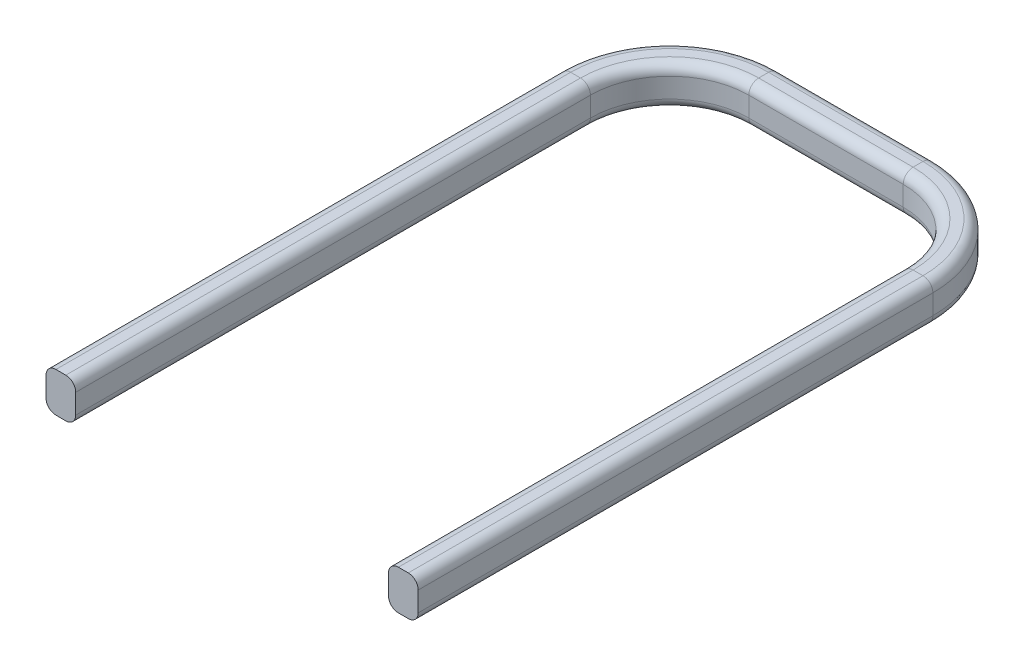
ISO-10303-21;
HEADER;
FILE_DESCRIPTION(('STEP AP214'),'2;1');
FILE_NAME('part.step','',(''),(''),'','','');
FILE_SCHEMA(('AUTOMOTIVE_DESIGN { 1 0 10303 214 1 1 1 1 }'));
ENDSEC;
DATA;
#1=APPLICATION_CONTEXT('core data for automotive mechanical design processes');
#2=APPLICATION_PROTOCOL_DEFINITION('international standard','automotive_design',2000,#1);
#3=PRODUCT_CONTEXT('',#1,'mechanical');
#4=PRODUCT('Part','Part','',(#3));
#5=PRODUCT_RELATED_PRODUCT_CATEGORY('part','',(#4));
#6=PRODUCT_DEFINITION_FORMATION('','',#4);
#7=PRODUCT_DEFINITION_CONTEXT('part definition',#1,'design');
#8=PRODUCT_DEFINITION('design','',#6,#7);
#9=PRODUCT_DEFINITION_SHAPE('','',#8);
#10=(LENGTH_UNIT() NAMED_UNIT(*) SI_UNIT(.MILLI.,.METRE.));
#11=(NAMED_UNIT(*) PLANE_ANGLE_UNIT() SI_UNIT($,.RADIAN.));
#12=(NAMED_UNIT(*) SI_UNIT($,.STERADIAN.) SOLID_ANGLE_UNIT());
#13=UNCERTAINTY_MEASURE_WITH_UNIT(LENGTH_MEASURE(1.E-05),#10,'distance_accuracy_value','');
#14=(GEOMETRIC_REPRESENTATION_CONTEXT(3) GLOBAL_UNCERTAINTY_ASSIGNED_CONTEXT((#13)) GLOBAL_UNIT_ASSIGNED_CONTEXT((#10,
#11,#12)) REPRESENTATION_CONTEXT('',''));
#15=CARTESIAN_POINT('',(0.,0.,0.));
#16=DIRECTION('',(0.,0.,1.));
#17=DIRECTION('',(1.,0.,0.));
#18=AXIS2_PLACEMENT_3D('',#15,#16,#17);
#19=CARTESIAN_POINT('',(0.,0.,0.));
#20=DIRECTION('',(0.,0.,-1.));
#21=DIRECTION('',(-1.,0.,0.));
#22=AXIS2_PLACEMENT_3D('',#19,#20,#21);
#23=PLANE('',#22);
#24=DIRECTION('',(0.,1.,0.));
#25=VECTOR('',#24,1.);
#26=CARTESIAN_POINT('',(3.95,0.,0.));
#27=LINE('',#26,#25);
#28=CARTESIAN_POINT('',(3.95,0.25,0.));
#29=VERTEX_POINT('',#28);
#30=CARTESIAN_POINT('',(3.95,0.75,0.));
#31=VERTEX_POINT('',#30);
#32=EDGE_CURVE('E302',#29,#31,#27,.T.);
#33=ORIENTED_EDGE('',*,*,#32,.F.);
#34=CARTESIAN_POINT('',(4.2,0.25,0.));
#35=DIRECTION('',(0.,0.,-1.));
#36=DIRECTION('',(-1.,0.,0.));
#37=AXIS2_PLACEMENT_3D('',#34,#35,#36);
#38=CIRCLE('',#37,0.25);
#39=CARTESIAN_POINT('',(4.2,0.,0.));
#40=VERTEX_POINT('',#39);
#41=EDGE_CURVE('E209',#29,#40,#38,.F.);
#42=ORIENTED_EDGE('',*,*,#41,.T.);
#43=DIRECTION('',(-1.,0.,0.));
#44=VECTOR('',#43,1.);
#45=CARTESIAN_POINT('',(3.95,0.,0.));
#46=LINE('',#45,#44);
#47=CARTESIAN_POINT('',(4.45,0.,0.));
#48=VERTEX_POINT('',#47);
#49=EDGE_CURVE('E432',#48,#40,#46,.T.);
#50=ORIENTED_EDGE('',*,*,#49,.F.);
#51=CARTESIAN_POINT('',(4.45,0.25,0.));
#52=DIRECTION('',(0.,0.,-1.));
#53=DIRECTION('',(-1.,0.,0.));
#54=AXIS2_PLACEMENT_3D('',#51,#52,#53);
#55=CIRCLE('',#54,0.25);
#56=CARTESIAN_POINT('',(4.7,0.25,0.));
#57=VERTEX_POINT('',#56);
#58=EDGE_CURVE('E230',#48,#57,#55,.F.);
#59=ORIENTED_EDGE('',*,*,#58,.T.);
#60=DIRECTION('',(0.,-1.,0.));
#61=VECTOR('',#60,1.);
#62=CARTESIAN_POINT('',(4.7,0.,0.));
#63=LINE('',#62,#61);
#64=CARTESIAN_POINT('',(4.7,0.75,0.));
#65=VERTEX_POINT('',#64);
#66=EDGE_CURVE('E429',#65,#57,#63,.T.);
#67=ORIENTED_EDGE('',*,*,#66,.F.);
#68=CARTESIAN_POINT('',(4.45,0.75,0.));
#69=DIRECTION('',(0.,0.,-1.));
#70=DIRECTION('',(-1.,0.,0.));
#71=AXIS2_PLACEMENT_3D('',#68,#69,#70);
#72=CIRCLE('',#71,0.25);
#73=CARTESIAN_POINT('',(4.45,1.,0.));
#74=VERTEX_POINT('',#73);
#75=EDGE_CURVE('E459',#65,#74,#72,.F.);
#76=ORIENTED_EDGE('',*,*,#75,.T.);
#77=DIRECTION('',(1.,0.,0.));
#78=VECTOR('',#77,1.);
#79=CARTESIAN_POINT('',(3.95,1.,0.));
#80=LINE('',#79,#78);
#81=CARTESIAN_POINT('',(4.2,1.,0.));
#82=VERTEX_POINT('',#81);
#83=EDGE_CURVE('E433',#82,#74,#80,.T.);
#84=ORIENTED_EDGE('',*,*,#83,.F.);
#85=CARTESIAN_POINT('',(4.2,0.75,0.));
#86=DIRECTION('',(0.,0.,-1.));
#87=DIRECTION('',(-1.,0.,0.));
#88=AXIS2_PLACEMENT_3D('',#85,#86,#87);
#89=CIRCLE('',#88,0.25);
#90=EDGE_CURVE('E462',#82,#31,#89,.F.);
#91=ORIENTED_EDGE('',*,*,#90,.T.);
#92=EDGE_LOOP('',(#33,#42,#50,#59,#67,#76,#84,#91));
#93=FACE_BOUND('',#92,.T.);
#94=ADVANCED_FACE('F33',(#93),#23,.F.);
#95=CARTESIAN_POINT('',(0.,0.,0.));
#96=DIRECTION('',(0.,0.,1.));
#97=DIRECTION('',(1.,0.,0.));
#98=AXIS2_PLACEMENT_3D('',#95,#96,#97);
#99=PLANE('',#98);
#100=DIRECTION('',(0.,-1.,0.));
#101=VECTOR('',#100,1.);
#102=CARTESIAN_POINT('',(-4.7,0.,0.));
#103=LINE('',#102,#101);
#104=CARTESIAN_POINT('',(-4.7,0.75,0.));
#105=VERTEX_POINT('',#104);
#106=CARTESIAN_POINT('',(-4.7,0.25,0.));
#107=VERTEX_POINT('',#106);
#108=EDGE_CURVE('E427',#105,#107,#103,.T.);
#109=ORIENTED_EDGE('',*,*,#108,.T.);
#110=CARTESIAN_POINT('',(-4.45,0.25,0.));
#111=DIRECTION('',(0.,0.,1.));
#112=DIRECTION('',(1.,0.,0.));
#113=AXIS2_PLACEMENT_3D('',#110,#111,#112);
#114=CIRCLE('',#113,0.25);
#115=CARTESIAN_POINT('',(-4.45,0.,0.));
#116=VERTEX_POINT('',#115);
#117=EDGE_CURVE('E349',#107,#116,#114,.T.);
#118=ORIENTED_EDGE('',*,*,#117,.T.);
#119=DIRECTION('',(1.,0.,0.));
#120=VECTOR('',#119,1.);
#121=CARTESIAN_POINT('',(-3.95,0.,0.));
#122=LINE('',#121,#120);
#123=CARTESIAN_POINT('',(-4.2,0.,0.));
#124=VERTEX_POINT('',#123);
#125=EDGE_CURVE('E231',#116,#124,#122,.T.);
#126=ORIENTED_EDGE('',*,*,#125,.T.);
#127=CARTESIAN_POINT('',(-4.2,0.25,0.));
#128=DIRECTION('',(0.,0.,1.));
#129=DIRECTION('',(1.,0.,0.));
#130=AXIS2_PLACEMENT_3D('',#127,#128,#129);
#131=CIRCLE('',#130,0.25);
#132=CARTESIAN_POINT('',(-3.95,0.25,0.));
#133=VERTEX_POINT('',#132);
#134=EDGE_CURVE('E345',#124,#133,#131,.T.);
#135=ORIENTED_EDGE('',*,*,#134,.T.);
#136=DIRECTION('',(0.,1.,0.));
#137=VECTOR('',#136,1.);
#138=CARTESIAN_POINT('',(-3.95,0.,0.));
#139=LINE('',#138,#137);
#140=CARTESIAN_POINT('',(-3.95,0.75,0.));
#141=VERTEX_POINT('',#140);
#142=EDGE_CURVE('E428',#133,#141,#139,.T.);
#143=ORIENTED_EDGE('',*,*,#142,.T.);
#144=CARTESIAN_POINT('',(-4.2,0.75,0.));
#145=DIRECTION('',(0.,0.,1.));
#146=DIRECTION('',(1.,0.,0.));
#147=AXIS2_PLACEMENT_3D('',#144,#145,#146);
#148=CIRCLE('',#147,0.25);
#149=CARTESIAN_POINT('',(-4.2,1.,0.));
#150=VERTEX_POINT('',#149);
#151=EDGE_CURVE('E281',#141,#150,#148,.T.);
#152=ORIENTED_EDGE('',*,*,#151,.T.);
#153=DIRECTION('',(-1.,0.,0.));
#154=VECTOR('',#153,1.);
#155=CARTESIAN_POINT('',(-3.95,1.,0.));
#156=LINE('',#155,#154);
#157=CARTESIAN_POINT('',(-4.45,1.,0.));
#158=VERTEX_POINT('',#157);
#159=EDGE_CURVE('E425',#150,#158,#156,.T.);
#160=ORIENTED_EDGE('',*,*,#159,.T.);
#161=CARTESIAN_POINT('',(-4.45,0.75,0.));
#162=DIRECTION('',(0.,0.,1.));
#163=DIRECTION('',(1.,0.,0.));
#164=AXIS2_PLACEMENT_3D('',#161,#162,#163);
#165=CIRCLE('',#164,0.25);
#166=EDGE_CURVE('E347',#158,#105,#165,.T.);
#167=ORIENTED_EDGE('',*,*,#166,.T.);
#168=EDGE_LOOP('',(#109,#118,#126,#135,#143,#152,#160,#167));
#169=FACE_BOUND('',#168,.T.);
#170=ADVANCED_FACE('F559',(#169),#99,.T.);
#171=CARTESIAN_POINT('',(3.95,0.,0.));
#172=DIRECTION('',(-1.,0.,0.));
#173=DIRECTION('',(0.,0.,1.));
#174=AXIS2_PLACEMENT_3D('',#171,#172,#173);
#175=PLANE('',#174);
#176=DIRECTION('',(0.,1.,0.));
#177=VECTOR('',#176,1.);
#178=CARTESIAN_POINT('',(3.95,0.,-13.));
#179=LINE('',#178,#177);
#180=CARTESIAN_POINT('',(3.95,0.25,-13.));
#181=VERTEX_POINT('',#180);
#182=CARTESIAN_POINT('',(3.95,0.75,-13.));
#183=VERTEX_POINT('',#182);
#184=EDGE_CURVE('E443',#181,#183,#179,.T.);
#185=ORIENTED_EDGE('',*,*,#184,.F.);
#186=DIRECTION('',(0.,0.,-1.));
#187=VECTOR('',#186,1.);
#188=CARTESIAN_POINT('',(3.95,0.25,0.));
#189=LINE('',#188,#187);
#190=EDGE_CURVE('E457',#181,#29,#189,.F.);
#191=ORIENTED_EDGE('',*,*,#190,.T.);
#192=ORIENTED_EDGE('',*,*,#32,.T.);
#193=DIRECTION('',(0.,0.,-1.));
#194=VECTOR('',#193,1.);
#195=CARTESIAN_POINT('',(3.95,0.75,0.));
#196=LINE('',#195,#194);
#197=EDGE_CURVE('E454',#31,#183,#196,.T.);
#198=ORIENTED_EDGE('',*,*,#197,.T.);
#199=EDGE_LOOP('',(#185,#191,#192,#198));
#200=FACE_BOUND('',#199,.T.);
#201=ADVANCED_FACE('F519',(#200),#175,.T.);
#202=CARTESIAN_POINT('',(3.95,1.,0.));
#203=DIRECTION('',(0.,1.,0.));
#204=DIRECTION('',(-1.,0.,0.));
#205=AXIS2_PLACEMENT_3D('',#202,#203,#204);
#206=PLANE('',#205);
#207=DIRECTION('',(1.,0.,0.));
#208=VECTOR('',#207,1.);
#209=CARTESIAN_POINT('',(3.95,1.,-13.));
#210=LINE('',#209,#208);
#211=CARTESIAN_POINT('',(4.2,1.,-13.));
#212=VERTEX_POINT('',#211);
#213=CARTESIAN_POINT('',(4.45,1.,-13.));
#214=VERTEX_POINT('',#213);
#215=EDGE_CURVE('E382',#212,#214,#210,.T.);
#216=ORIENTED_EDGE('',*,*,#215,.F.);
#217=DIRECTION('',(0.,0.,-1.));
#218=VECTOR('',#217,1.);
#219=CARTESIAN_POINT('',(4.2,1.,0.));
#220=LINE('',#219,#218);
#221=EDGE_CURVE('E287',#212,#82,#220,.F.);
#222=ORIENTED_EDGE('',*,*,#221,.T.);
#223=ORIENTED_EDGE('',*,*,#83,.T.);
#224=DIRECTION('',(0.,0.,-1.));
#225=VECTOR('',#224,1.);
#226=CARTESIAN_POINT('',(4.45,1.,0.));
#227=LINE('',#226,#225);
#228=EDGE_CURVE('E50',#74,#214,#227,.T.);
#229=ORIENTED_EDGE('',*,*,#228,.T.);
#230=EDGE_LOOP('',(#216,#222,#223,#229));
#231=FACE_BOUND('',#230,.T.);
#232=ADVANCED_FACE('F489',(#231),#206,.T.);
#233=CARTESIAN_POINT('',(4.7,0.,0.));
#234=DIRECTION('',(1.,0.,0.));
#235=DIRECTION('',(0.,0.,-1.));
#236=AXIS2_PLACEMENT_3D('',#233,#234,#235);
#237=PLANE('',#236);
#238=ORIENTED_EDGE('',*,*,#66,.T.);
#239=DIRECTION('',(0.,0.,-1.));
#240=VECTOR('',#239,1.);
#241=CARTESIAN_POINT('',(4.7,0.25,0.));
#242=LINE('',#241,#240);
#243=CARTESIAN_POINT('',(4.7,0.25,-13.));
#244=VERTEX_POINT('',#243);
#245=EDGE_CURVE('E11',#57,#244,#242,.T.);
#246=ORIENTED_EDGE('',*,*,#245,.T.);
#247=DIRECTION('',(0.,-1.,0.));
#248=VECTOR('',#247,1.);
#249=CARTESIAN_POINT('',(4.7,0.,-13.));
#250=LINE('',#249,#248);
#251=CARTESIAN_POINT('',(4.7,0.75,-13.));
#252=VERTEX_POINT('',#251);
#253=EDGE_CURVE('E221',#252,#244,#250,.T.);
#254=ORIENTED_EDGE('',*,*,#253,.F.);
#255=DIRECTION('',(0.,0.,-1.));
#256=VECTOR('',#255,1.);
#257=CARTESIAN_POINT('',(4.7,0.75,0.));
#258=LINE('',#257,#256);
#259=EDGE_CURVE('E42',#252,#65,#258,.F.);
#260=ORIENTED_EDGE('',*,*,#259,.T.);
#261=EDGE_LOOP('',(#238,#246,#254,#260));
#262=FACE_BOUND('',#261,.T.);
#263=ADVANCED_FACE('F524',(#262),#237,.T.);
#264=CARTESIAN_POINT('',(3.95,0.,0.));
#265=DIRECTION('',(0.,-1.,0.));
#266=DIRECTION('',(1.,0.,0.));
#267=AXIS2_PLACEMENT_3D('',#264,#265,#266);
#268=PLANE('',#267);
#269=ORIENTED_EDGE('',*,*,#49,.T.);
#270=DIRECTION('',(0.,0.,-1.));
#271=VECTOR('',#270,1.);
#272=CARTESIAN_POINT('',(4.2,0.,0.));
#273=LINE('',#272,#271);
#274=CARTESIAN_POINT('',(4.2,0.,-13.));
#275=VERTEX_POINT('',#274);
#276=EDGE_CURVE('E219',#40,#275,#273,.T.);
#277=ORIENTED_EDGE('',*,*,#276,.T.);
#278=DIRECTION('',(-1.,0.,0.));
#279=VECTOR('',#278,1.);
#280=CARTESIAN_POINT('',(3.95,0.,-13.));
#281=LINE('',#280,#279);
#282=CARTESIAN_POINT('',(4.45,0.,-13.));
#283=VERTEX_POINT('',#282);
#284=EDGE_CURVE('E201',#283,#275,#281,.T.);
#285=ORIENTED_EDGE('',*,*,#284,.F.);
#286=DIRECTION('',(0.,0.,-1.));
#287=VECTOR('',#286,1.);
#288=CARTESIAN_POINT('',(4.45,0.,0.));
#289=LINE('',#288,#287);
#290=EDGE_CURVE('E216',#283,#48,#289,.F.);
#291=ORIENTED_EDGE('',*,*,#290,.T.);
#292=EDGE_LOOP('',(#269,#277,#285,#291));
#293=FACE_BOUND('',#292,.T.);
#294=ADVANCED_FACE('F215',(#293),#268,.T.);
#295=CARTESIAN_POINT('',(1.95,0.,-13.));
#296=DIRECTION('',(0.,1.,0.));
#297=DIRECTION('',(0.,0.,1.));
#298=AXIS2_PLACEMENT_3D('',#295,#296,#297);
#299=CYLINDRICAL_SURFACE('',#298,2.);
#300=DIRECTION('',(0.,1.,0.));
#301=VECTOR('',#300,1.);
#302=CARTESIAN_POINT('',(1.94999999999999,0.,-15.));
#303=LINE('',#302,#301);
#304=CARTESIAN_POINT('',(1.94999999999999,0.25,-15.));
#305=VERTEX_POINT('',#304);
#306=CARTESIAN_POINT('',(1.94999999999999,0.75,-15.));
#307=VERTEX_POINT('',#306);
#308=EDGE_CURVE('E220',#305,#307,#303,.T.);
#309=ORIENTED_EDGE('',*,*,#308,.F.);
#310=CARTESIAN_POINT('',(1.95,0.25,-13.));
#311=DIRECTION('',(0.,-1.,0.));
#312=DIRECTION('',(0.,0.,-1.));
#313=AXIS2_PLACEMENT_3D('',#310,#311,#312);
#314=CIRCLE('',#313,2.);
#315=EDGE_CURVE('E322',#305,#181,#314,.T.);
#316=ORIENTED_EDGE('',*,*,#315,.T.);
#317=ORIENTED_EDGE('',*,*,#184,.T.);
#318=CARTESIAN_POINT('',(1.95,0.75,-13.));
#319=DIRECTION('',(0.,1.,0.));
#320=DIRECTION('',(0.,0.,1.));
#321=AXIS2_PLACEMENT_3D('',#318,#319,#320);
#322=CIRCLE('',#321,2.);
#323=EDGE_CURVE('E326',#183,#307,#322,.T.);
#324=ORIENTED_EDGE('',*,*,#323,.T.);
#325=EDGE_LOOP('',(#309,#316,#317,#324));
#326=FACE_BOUND('',#325,.T.);
#327=ADVANCED_FACE('F470',(#326),#299,.F.);
#328=CARTESIAN_POINT('',(3.95,1.,-13.));
#329=DIRECTION('',(0.,1.,0.));
#330=DIRECTION('',(0.,0.,1.));
#331=AXIS2_PLACEMENT_3D('',#328,#329,#330);
#332=PLANE('',#331);
#333=ORIENTED_EDGE('',*,*,#215,.T.);
#334=CARTESIAN_POINT('',(1.95,1.,-13.));
#335=DIRECTION('',(0.,1.,0.));
#336=DIRECTION('',(0.,0.,1.));
#337=AXIS2_PLACEMENT_3D('',#334,#335,#336);
#338=CIRCLE('',#337,2.5);
#339=CARTESIAN_POINT('',(1.94999999999998,1.,-15.5));
#340=VERTEX_POINT('',#339);
#341=EDGE_CURVE('E376',#214,#340,#338,.T.);
#342=ORIENTED_EDGE('',*,*,#341,.T.);
#343=DIRECTION('',(0.,0.,-1.));
#344=VECTOR('',#343,1.);
#345=CARTESIAN_POINT('',(1.94999999999999,1.,-15.));
#346=LINE('',#345,#344);
#347=CARTESIAN_POINT('',(1.94999999999998,1.,-15.25));
#348=VERTEX_POINT('',#347);
#349=EDGE_CURVE('E380',#348,#340,#346,.T.);
#350=ORIENTED_EDGE('',*,*,#349,.F.);
#351=CARTESIAN_POINT('',(1.95,1.,-13.));
#352=DIRECTION('',(0.,1.,0.));
#353=DIRECTION('',(0.,0.,1.));
#354=AXIS2_PLACEMENT_3D('',#351,#352,#353);
#355=CIRCLE('',#354,2.25);
#356=EDGE_CURVE('E57',#348,#212,#355,.F.);
#357=ORIENTED_EDGE('',*,*,#356,.T.);
#358=EDGE_LOOP('',(#333,#342,#350,#357));
#359=FACE_BOUND('',#358,.T.);
#360=ADVANCED_FACE('F379',(#359),#332,.T.);
#361=CARTESIAN_POINT('',(1.95,0.,-13.));
#362=DIRECTION('',(0.,1.,0.));
#363=DIRECTION('',(0.,0.,1.));
#364=AXIS2_PLACEMENT_3D('',#361,#362,#363);
#365=CYLINDRICAL_SURFACE('',#364,2.75);
#366=ORIENTED_EDGE('',*,*,#253,.T.);
#367=CARTESIAN_POINT('',(1.95,0.25,-13.));
#368=DIRECTION('',(0.,-1.,0.));
#369=DIRECTION('',(0.,0.,-1.));
#370=AXIS2_PLACEMENT_3D('',#367,#368,#369);
#371=CIRCLE('',#370,2.75);
#372=CARTESIAN_POINT('',(1.94999999999998,0.25,-15.75));
#373=VERTEX_POINT('',#372);
#374=EDGE_CURVE('E234',#244,#373,#371,.F.);
#375=ORIENTED_EDGE('',*,*,#374,.T.);
#376=DIRECTION('',(0.,-1.,0.));
#377=VECTOR('',#376,1.);
#378=CARTESIAN_POINT('',(1.94999999999998,0.,-15.75));
#379=LINE('',#378,#377);
#380=CARTESIAN_POINT('',(1.94999999999998,0.75,-15.75));
#381=VERTEX_POINT('',#380);
#382=EDGE_CURVE('E391',#381,#373,#379,.T.);
#383=ORIENTED_EDGE('',*,*,#382,.F.);
#384=CARTESIAN_POINT('',(1.95,0.75,-13.));
#385=DIRECTION('',(0.,1.,0.));
#386=DIRECTION('',(0.,0.,1.));
#387=AXIS2_PLACEMENT_3D('',#384,#385,#386);
#388=CIRCLE('',#387,2.75);
#389=EDGE_CURVE('E361',#381,#252,#388,.F.);
#390=ORIENTED_EDGE('',*,*,#389,.T.);
#391=EDGE_LOOP('',(#366,#375,#383,#390));
#392=FACE_BOUND('',#391,.T.);
#393=ADVANCED_FACE('F793',(#392),#365,.T.);
#394=CARTESIAN_POINT('',(3.95,0.,-13.));
#395=DIRECTION('',(0.,-1.,0.));
#396=DIRECTION('',(0.,0.,-1.));
#397=AXIS2_PLACEMENT_3D('',#394,#395,#396);
#398=PLANE('',#397);
#399=ORIENTED_EDGE('',*,*,#284,.T.);
#400=CARTESIAN_POINT('',(1.95,0.,-13.));
#401=DIRECTION('',(0.,-1.,0.));
#402=DIRECTION('',(0.,0.,-1.));
#403=AXIS2_PLACEMENT_3D('',#400,#401,#402);
#404=CIRCLE('',#403,2.25);
#405=CARTESIAN_POINT('',(1.94999999999998,0.,-15.25));
#406=VERTEX_POINT('',#405);
#407=EDGE_CURVE('E208',#275,#406,#404,.F.);
#408=ORIENTED_EDGE('',*,*,#407,.T.);
#409=DIRECTION('',(0.,0.,1.));
#410=VECTOR('',#409,1.);
#411=CARTESIAN_POINT('',(1.94999999999999,0.,-15.));
#412=LINE('',#411,#410);
#413=CARTESIAN_POINT('',(1.94999999999998,0.,-15.5));
#414=VERTEX_POINT('',#413);
#415=EDGE_CURVE('E203',#414,#406,#412,.T.);
#416=ORIENTED_EDGE('',*,*,#415,.F.);
#417=CARTESIAN_POINT('',(1.95,0.,-13.));
#418=DIRECTION('',(0.,-1.,0.));
#419=DIRECTION('',(0.,0.,-1.));
#420=AXIS2_PLACEMENT_3D('',#417,#418,#419);
#421=CIRCLE('',#420,2.5);
#422=EDGE_CURVE('E198',#414,#283,#421,.T.);
#423=ORIENTED_EDGE('',*,*,#422,.T.);
#424=EDGE_LOOP('',(#399,#408,#416,#423));
#425=FACE_BOUND('',#424,.T.);
#426=ADVANCED_FACE('F200',(#425),#398,.T.);
#427=CARTESIAN_POINT('',(1.94999999999999,0.,-15.));
#428=DIRECTION('',(0.,0.,1.));
#429=DIRECTION('',(1.,0.,0.));
#430=AXIS2_PLACEMENT_3D('',#427,#428,#429);
#431=PLANE('',#430);
#432=DIRECTION('',(0.,1.,0.));
#433=VECTOR('',#432,1.);
#434=CARTESIAN_POINT('',(-1.95,0.,-15.));
#435=LINE('',#434,#433);
#436=CARTESIAN_POINT('',(-1.95,0.25,-15.));
#437=VERTEX_POINT('',#436);
#438=CARTESIAN_POINT('',(-1.95,0.75,-15.));
#439=VERTEX_POINT('',#438);
#440=EDGE_CURVE('E446',#437,#439,#435,.T.);
#441=ORIENTED_EDGE('',*,*,#440,.F.);
#442=DIRECTION('',(-1.,0.,0.));
#443=VECTOR('',#442,1.);
#444=CARTESIAN_POINT('',(1.94999999999999,0.25,-15.));
#445=LINE('',#444,#443);
#446=EDGE_CURVE('E331',#437,#305,#445,.F.);
#447=ORIENTED_EDGE('',*,*,#446,.T.);
#448=ORIENTED_EDGE('',*,*,#308,.T.);
#449=DIRECTION('',(-1.,0.,0.));
#450=VECTOR('',#449,1.);
#451=CARTESIAN_POINT('',(1.94999999999999,0.75,-15.));
#452=LINE('',#451,#450);
#453=EDGE_CURVE('E324',#307,#439,#452,.T.);
#454=ORIENTED_EDGE('',*,*,#453,.T.);
#455=EDGE_LOOP('',(#441,#447,#448,#454));
#456=FACE_BOUND('',#455,.T.);
#457=ADVANCED_FACE('F477',(#456),#431,.T.);
#458=CARTESIAN_POINT('',(1.94999999999999,1.,-15.));
#459=DIRECTION('',(0.,1.,0.));
#460=DIRECTION('',(0.,0.,1.));
#461=AXIS2_PLACEMENT_3D('',#458,#459,#460);
#462=PLANE('',#461);
#463=ORIENTED_EDGE('',*,*,#349,.T.);
#464=DIRECTION('',(-1.,0.,0.));
#465=VECTOR('',#464,1.);
#466=CARTESIAN_POINT('',(1.94999999999999,1.,-15.5));
#467=LINE('',#466,#465);
#468=CARTESIAN_POINT('',(-1.95,1.,-15.5));
#469=VERTEX_POINT('',#468);
#470=EDGE_CURVE('E373',#340,#469,#467,.T.);
#471=ORIENTED_EDGE('',*,*,#470,.T.);
#472=DIRECTION('',(0.,0.,-1.));
#473=VECTOR('',#472,1.);
#474=CARTESIAN_POINT('',(-1.95,1.,-15.));
#475=LINE('',#474,#473);
#476=CARTESIAN_POINT('',(-1.95,1.,-15.25));
#477=VERTEX_POINT('',#476);
#478=EDGE_CURVE('E410',#477,#469,#475,.T.);
#479=ORIENTED_EDGE('',*,*,#478,.F.);
#480=DIRECTION('',(-1.,0.,0.));
#481=VECTOR('',#480,1.);
#482=CARTESIAN_POINT('',(1.94999999999999,1.,-15.25));
#483=LINE('',#482,#481);
#484=EDGE_CURVE('E371',#477,#348,#483,.F.);
#485=ORIENTED_EDGE('',*,*,#484,.T.);
#486=EDGE_LOOP('',(#463,#471,#479,#485));
#487=FACE_BOUND('',#486,.T.);
#488=ADVANCED_FACE('F387',(#487),#462,.T.);
#489=CARTESIAN_POINT('',(1.94999999999999,0.,-15.75));
#490=DIRECTION('',(0.,0.,-1.));
#491=DIRECTION('',(-1.,0.,0.));
#492=AXIS2_PLACEMENT_3D('',#489,#490,#491);
#493=PLANE('',#492);
#494=ORIENTED_EDGE('',*,*,#382,.T.);
#495=DIRECTION('',(-1.,0.,0.));
#496=VECTOR('',#495,1.);
#497=CARTESIAN_POINT('',(1.94999999999999,0.25,-15.75));
#498=LINE('',#497,#496);
#499=CARTESIAN_POINT('',(-1.95,0.25,-15.75));
#500=VERTEX_POINT('',#499);
#501=EDGE_CURVE('E317',#373,#500,#498,.T.);
#502=ORIENTED_EDGE('',*,*,#501,.T.);
#503=DIRECTION('',(0.,-1.,0.));
#504=VECTOR('',#503,1.);
#505=CARTESIAN_POINT('',(-1.95,0.,-15.75));
#506=LINE('',#505,#504);
#507=CARTESIAN_POINT('',(-1.95,0.75,-15.75));
#508=VERTEX_POINT('',#507);
#509=EDGE_CURVE('E438',#508,#500,#506,.T.);
#510=ORIENTED_EDGE('',*,*,#509,.F.);
#511=DIRECTION('',(-1.,0.,0.));
#512=VECTOR('',#511,1.);
#513=CARTESIAN_POINT('',(1.94999999999999,0.75,-15.75));
#514=LINE('',#513,#512);
#515=EDGE_CURVE('E358',#508,#381,#514,.F.);
#516=ORIENTED_EDGE('',*,*,#515,.T.);
#517=EDGE_LOOP('',(#494,#502,#510,#516));
#518=FACE_BOUND('',#517,.T.);
#519=ADVANCED_FACE('F764',(#518),#493,.T.);
#520=CARTESIAN_POINT('',(1.94999999999999,0.,-15.));
#521=DIRECTION('',(0.,-1.,0.));
#522=DIRECTION('',(0.,0.,-1.));
#523=AXIS2_PLACEMENT_3D('',#520,#521,#522);
#524=PLANE('',#523);
#525=ORIENTED_EDGE('',*,*,#415,.T.);
#526=DIRECTION('',(-1.,0.,0.));
#527=VECTOR('',#526,1.);
#528=CARTESIAN_POINT('',(1.94999999999999,0.,-15.25));
#529=LINE('',#528,#527);
#530=CARTESIAN_POINT('',(-1.95,0.,-15.25));
#531=VERTEX_POINT('',#530);
#532=EDGE_CURVE('E321',#406,#531,#529,.T.);
#533=ORIENTED_EDGE('',*,*,#532,.T.);
#534=DIRECTION('',(0.,0.,1.));
#535=VECTOR('',#534,1.);
#536=CARTESIAN_POINT('',(-1.95,0.,-15.));
#537=LINE('',#536,#535);
#538=CARTESIAN_POINT('',(-1.95,0.,-15.5));
#539=VERTEX_POINT('',#538);
#540=EDGE_CURVE('E421',#539,#531,#537,.T.);
#541=ORIENTED_EDGE('',*,*,#540,.F.);
#542=DIRECTION('',(-1.,0.,0.));
#543=VECTOR('',#542,1.);
#544=CARTESIAN_POINT('',(1.94999999999999,0.,-15.5));
#545=LINE('',#544,#543);
#546=EDGE_CURVE('E318',#539,#414,#545,.F.);
#547=ORIENTED_EDGE('',*,*,#546,.T.);
#548=EDGE_LOOP('',(#525,#533,#541,#547));
#549=FACE_BOUND('',#548,.T.);
#550=ADVANCED_FACE('F756',(#549),#524,.T.);
#551=CARTESIAN_POINT('',(-1.95,0.,-13.));
#552=DIRECTION('',(0.,1.,0.));
#553=DIRECTION('',(0.,0.,1.));
#554=AXIS2_PLACEMENT_3D('',#551,#552,#553);
#555=CYLINDRICAL_SURFACE('',#554,2.);
#556=DIRECTION('',(0.,1.,0.));
#557=VECTOR('',#556,1.);
#558=CARTESIAN_POINT('',(-3.95,0.,-13.));
#559=LINE('',#558,#557);
#560=CARTESIAN_POINT('',(-3.95,0.25,-13.));
#561=VERTEX_POINT('',#560);
#562=CARTESIAN_POINT('',(-3.95,0.75,-13.));
#563=VERTEX_POINT('',#562);
#564=EDGE_CURVE('E416',#561,#563,#559,.T.);
#565=ORIENTED_EDGE('',*,*,#564,.F.);
#566=CARTESIAN_POINT('',(-1.95,0.25,-13.));
#567=DIRECTION('',(0.,-1.,0.));
#568=DIRECTION('',(0.,0.,-1.));
#569=AXIS2_PLACEMENT_3D('',#566,#567,#568);
#570=CIRCLE('',#569,2.);
#571=EDGE_CURVE('E337',#561,#437,#570,.T.);
#572=ORIENTED_EDGE('',*,*,#571,.T.);
#573=ORIENTED_EDGE('',*,*,#440,.T.);
#574=CARTESIAN_POINT('',(-1.95,0.75,-13.));
#575=DIRECTION('',(0.,1.,0.));
#576=DIRECTION('',(0.,0.,1.));
#577=AXIS2_PLACEMENT_3D('',#574,#575,#576);
#578=CIRCLE('',#577,2.);
#579=EDGE_CURVE('E273',#439,#563,#578,.T.);
#580=ORIENTED_EDGE('',*,*,#579,.T.);
#581=EDGE_LOOP('',(#565,#572,#573,#580));
#582=FACE_BOUND('',#581,.T.);
#583=ADVANCED_FACE('F503',(#582),#555,.F.);
#584=CARTESIAN_POINT('',(-1.95,1.,-15.));
#585=DIRECTION('',(0.,1.,0.));
#586=DIRECTION('',(0.,0.,1.));
#587=AXIS2_PLACEMENT_3D('',#584,#585,#586);
#588=PLANE('',#587);
#589=ORIENTED_EDGE('',*,*,#478,.T.);
#590=CARTESIAN_POINT('',(-1.95,1.,-13.));
#591=DIRECTION('',(0.,1.,0.));
#592=DIRECTION('',(0.,0.,1.));
#593=AXIS2_PLACEMENT_3D('',#590,#591,#592);
#594=CIRCLE('',#593,2.5);
#595=CARTESIAN_POINT('',(-4.45,1.,-13.));
#596=VERTEX_POINT('',#595);
#597=EDGE_CURVE('E369',#469,#596,#594,.T.);
#598=ORIENTED_EDGE('',*,*,#597,.T.);
#599=DIRECTION('',(-1.,0.,0.));
#600=VECTOR('',#599,1.);
#601=CARTESIAN_POINT('',(-3.95,1.,-13.));
#602=LINE('',#601,#600);
#603=CARTESIAN_POINT('',(-4.2,1.,-13.));
#604=VERTEX_POINT('',#603);
#605=EDGE_CURVE('E409',#604,#596,#602,.T.);
#606=ORIENTED_EDGE('',*,*,#605,.F.);
#607=CARTESIAN_POINT('',(-1.95,1.,-13.));
#608=DIRECTION('',(0.,1.,0.));
#609=DIRECTION('',(0.,0.,1.));
#610=AXIS2_PLACEMENT_3D('',#607,#608,#609);
#611=CIRCLE('',#610,2.25);
#612=EDGE_CURVE('E274',#604,#477,#611,.F.);
#613=ORIENTED_EDGE('',*,*,#612,.T.);
#614=EDGE_LOOP('',(#589,#598,#606,#613));
#615=FACE_BOUND('',#614,.T.);
#616=ADVANCED_FACE('F408',(#615),#588,.T.);
#617=CARTESIAN_POINT('',(-1.95,0.,-13.));
#618=DIRECTION('',(0.,1.,0.));
#619=DIRECTION('',(0.,0.,1.));
#620=AXIS2_PLACEMENT_3D('',#617,#618,#619);
#621=CYLINDRICAL_SURFACE('',#620,2.75);
#622=ORIENTED_EDGE('',*,*,#509,.T.);
#623=CARTESIAN_POINT('',(-1.95,0.25,-13.));
#624=DIRECTION('',(0.,-1.,0.));
#625=DIRECTION('',(0.,0.,-1.));
#626=AXIS2_PLACEMENT_3D('',#623,#624,#625);
#627=CIRCLE('',#626,2.75);
#628=CARTESIAN_POINT('',(-4.7,0.25,-13.));
#629=VERTEX_POINT('',#628);
#630=EDGE_CURVE('E312',#500,#629,#627,.F.);
#631=ORIENTED_EDGE('',*,*,#630,.T.);
#632=DIRECTION('',(0.,-1.,0.));
#633=VECTOR('',#632,1.);
#634=CARTESIAN_POINT('',(-4.7,0.,-13.));
#635=LINE('',#634,#633);
#636=CARTESIAN_POINT('',(-4.7,0.75,-13.));
#637=VERTEX_POINT('',#636);
#638=EDGE_CURVE('E415',#637,#629,#635,.T.);
#639=ORIENTED_EDGE('',*,*,#638,.F.);
#640=CARTESIAN_POINT('',(-1.95,0.75,-13.));
#641=DIRECTION('',(0.,1.,0.));
#642=DIRECTION('',(0.,0.,1.));
#643=AXIS2_PLACEMENT_3D('',#640,#641,#642);
#644=CIRCLE('',#643,2.75);
#645=EDGE_CURVE('E355',#637,#508,#644,.F.);
#646=ORIENTED_EDGE('',*,*,#645,.T.);
#647=EDGE_LOOP('',(#622,#631,#639,#646));
#648=FACE_BOUND('',#647,.T.);
#649=ADVANCED_FACE('F733',(#648),#621,.T.);
#650=CARTESIAN_POINT('',(-1.95,0.,-15.));
#651=DIRECTION('',(0.,-1.,0.));
#652=DIRECTION('',(0.,0.,-1.));
#653=AXIS2_PLACEMENT_3D('',#650,#651,#652);
#654=PLANE('',#653);
#655=ORIENTED_EDGE('',*,*,#540,.T.);
#656=CARTESIAN_POINT('',(-1.95,0.,-13.));
#657=DIRECTION('',(0.,-1.,0.));
#658=DIRECTION('',(0.,0.,-1.));
#659=AXIS2_PLACEMENT_3D('',#656,#657,#658);
#660=CIRCLE('',#659,2.25);
#661=CARTESIAN_POINT('',(-4.2,0.,-13.));
#662=VERTEX_POINT('',#661);
#663=EDGE_CURVE('E334',#531,#662,#660,.F.);
#664=ORIENTED_EDGE('',*,*,#663,.T.);
#665=DIRECTION('',(1.,0.,0.));
#666=VECTOR('',#665,1.);
#667=CARTESIAN_POINT('',(-3.95,0.,-13.));
#668=LINE('',#667,#666);
#669=CARTESIAN_POINT('',(-4.45,0.,-13.));
#670=VERTEX_POINT('',#669);
#671=EDGE_CURVE('E419',#670,#662,#668,.T.);
#672=ORIENTED_EDGE('',*,*,#671,.F.);
#673=CARTESIAN_POINT('',(-1.95,0.,-13.));
#674=DIRECTION('',(0.,-1.,0.));
#675=DIRECTION('',(0.,0.,-1.));
#676=AXIS2_PLACEMENT_3D('',#673,#674,#675);
#677=CIRCLE('',#676,2.5);
#678=EDGE_CURVE('E311',#670,#539,#677,.T.);
#679=ORIENTED_EDGE('',*,*,#678,.T.);
#680=EDGE_LOOP('',(#655,#664,#672,#679));
#681=FACE_BOUND('',#680,.T.);
#682=ADVANCED_FACE('F557',(#681),#654,.T.);
#683=CARTESIAN_POINT('',(-3.95,0.,-13.));
#684=DIRECTION('',(1.,0.,0.));
#685=DIRECTION('',(0.,0.,-1.));
#686=AXIS2_PLACEMENT_3D('',#683,#684,#685);
#687=PLANE('',#686);
#688=ORIENTED_EDGE('',*,*,#142,.F.);
#689=DIRECTION('',(0.,0.,1.));
#690=VECTOR('',#689,1.);
#691=CARTESIAN_POINT('',(-3.95,0.25,-13.));
#692=LINE('',#691,#690);
#693=EDGE_CURVE('E286',#133,#561,#692,.F.);
#694=ORIENTED_EDGE('',*,*,#693,.T.);
#695=ORIENTED_EDGE('',*,*,#564,.T.);
#696=DIRECTION('',(0.,0.,1.));
#697=VECTOR('',#696,1.);
#698=CARTESIAN_POINT('',(-3.95,0.75,-13.));
#699=LINE('',#698,#697);
#700=EDGE_CURVE('E280',#563,#141,#699,.T.);
#701=ORIENTED_EDGE('',*,*,#700,.T.);
#702=EDGE_LOOP('',(#688,#694,#695,#701));
#703=FACE_BOUND('',#702,.T.);
#704=ADVANCED_FACE('F718',(#703),#687,.T.);
#705=CARTESIAN_POINT('',(-3.95,1.,-13.));
#706=DIRECTION('',(0.,1.,0.));
#707=DIRECTION('',(-1.,0.,0.));
#708=AXIS2_PLACEMENT_3D('',#705,#706,#707);
#709=PLANE('',#708);
#710=ORIENTED_EDGE('',*,*,#605,.T.);
#711=DIRECTION('',(0.,0.,1.));
#712=VECTOR('',#711,1.);
#713=CARTESIAN_POINT('',(-4.45,1.,-13.));
#714=LINE('',#713,#712);
#715=EDGE_CURVE('E365',#596,#158,#714,.T.);
#716=ORIENTED_EDGE('',*,*,#715,.T.);
#717=ORIENTED_EDGE('',*,*,#159,.F.);
#718=DIRECTION('',(0.,0.,1.));
#719=VECTOR('',#718,1.);
#720=CARTESIAN_POINT('',(-4.2,1.,-13.));
#721=LINE('',#720,#719);
#722=EDGE_CURVE('E279',#150,#604,#721,.F.);
#723=ORIENTED_EDGE('',*,*,#722,.T.);
#724=EDGE_LOOP('',(#710,#716,#717,#723));
#725=FACE_BOUND('',#724,.T.);
#726=ADVANCED_FACE('F412',(#725),#709,.T.);
#727=CARTESIAN_POINT('',(-4.7,0.,-13.));
#728=DIRECTION('',(-1.,0.,0.));
#729=DIRECTION('',(0.,0.,1.));
#730=AXIS2_PLACEMENT_3D('',#727,#728,#729);
#731=PLANE('',#730);
#732=ORIENTED_EDGE('',*,*,#638,.T.);
#733=DIRECTION('',(0.,0.,1.));
#734=VECTOR('',#733,1.);
#735=CARTESIAN_POINT('',(-4.7,0.25,-13.));
#736=LINE('',#735,#734);
#737=EDGE_CURVE('E341',#629,#107,#736,.T.);
#738=ORIENTED_EDGE('',*,*,#737,.T.);
#739=ORIENTED_EDGE('',*,*,#108,.F.);
#740=DIRECTION('',(0.,0.,1.));
#741=VECTOR('',#740,1.);
#742=CARTESIAN_POINT('',(-4.7,0.75,-13.));
#743=LINE('',#742,#741);
#744=EDGE_CURVE('E339',#105,#637,#743,.F.);
#745=ORIENTED_EDGE('',*,*,#744,.T.);
#746=EDGE_LOOP('',(#732,#738,#739,#745));
#747=FACE_BOUND('',#746,.T.);
#748=ADVANCED_FACE('F543',(#747),#731,.T.);
#749=CARTESIAN_POINT('',(-3.95,0.,-13.));
#750=DIRECTION('',(0.,-1.,0.));
#751=DIRECTION('',(1.,0.,0.));
#752=AXIS2_PLACEMENT_3D('',#749,#750,#751);
#753=PLANE('',#752);
#754=ORIENTED_EDGE('',*,*,#125,.F.);
#755=DIRECTION('',(0.,0.,1.));
#756=VECTOR('',#755,1.);
#757=CARTESIAN_POINT('',(-4.45,0.,-13.));
#758=LINE('',#757,#756);
#759=EDGE_CURVE('E353',#116,#670,#758,.F.);
#760=ORIENTED_EDGE('',*,*,#759,.T.);
#761=ORIENTED_EDGE('',*,*,#671,.T.);
#762=DIRECTION('',(0.,0.,1.));
#763=VECTOR('',#762,1.);
#764=CARTESIAN_POINT('',(-4.2,0.,-13.));
#765=LINE('',#764,#763);
#766=EDGE_CURVE('E351',#662,#124,#765,.T.);
#767=ORIENTED_EDGE('',*,*,#766,.T.);
#768=EDGE_LOOP('',(#754,#760,#761,#767));
#769=FACE_BOUND('',#768,.T.);
#770=ADVANCED_FACE('F540',(#769),#753,.T.);
#771=CARTESIAN_POINT('',(-4.2,0.25,-13.));
#772=DIRECTION('',(0.,0.,1.));
#773=DIRECTION('',(1.,0.,0.));
#774=AXIS2_PLACEMENT_3D('',#771,#772,#773);
#775=CYLINDRICAL_SURFACE('',#774,0.25);
#776=ORIENTED_EDGE('',*,*,#134,.F.);
#777=ORIENTED_EDGE('',*,*,#766,.F.);
#778=CARTESIAN_POINT('',(-4.2,0.25,-13.));
#779=DIRECTION('',(0.,0.,-1.));
#780=DIRECTION('',(-1.,0.,0.));
#781=AXIS2_PLACEMENT_3D('',#778,#779,#780);
#782=CIRCLE('',#781,0.25);
#783=EDGE_CURVE('E299',#561,#662,#782,.T.);
#784=ORIENTED_EDGE('',*,*,#783,.F.);
#785=ORIENTED_EDGE('',*,*,#693,.F.);
#786=EDGE_LOOP('',(#776,#777,#784,#785));
#787=FACE_BOUND('',#786,.T.);
#788=ADVANCED_FACE('F542',(#787),#775,.T.);
#789=CARTESIAN_POINT('',(-1.95,0.25,-13.));
#790=DIRECTION('',(0.,-1.,0.));
#791=DIRECTION('',(0.,0.,-1.));
#792=AXIS2_PLACEMENT_3D('',#789,#790,#791);
#793=TOROIDAL_SURFACE('',#792,2.25,0.25);
#794=ORIENTED_EDGE('',*,*,#783,.T.);
#795=ORIENTED_EDGE('',*,*,#663,.F.);
#796=CARTESIAN_POINT('',(-1.95,0.25,-15.25));
#797=DIRECTION('',(1.,0.,0.));
#798=DIRECTION('',(0.,0.,-1.));
#799=AXIS2_PLACEMENT_3D('',#796,#797,#798);
#800=CIRCLE('',#799,0.25);
#801=EDGE_CURVE('E296',#437,#531,#800,.T.);
#802=ORIENTED_EDGE('',*,*,#801,.F.);
#803=ORIENTED_EDGE('',*,*,#571,.F.);
#804=EDGE_LOOP('',(#794,#795,#802,#803));
#805=FACE_BOUND('',#804,.T.);
#806=ADVANCED_FACE('F508',(#805),#793,.T.);
#807=CARTESIAN_POINT('',(1.94999999999999,0.25,-15.25));
#808=DIRECTION('',(-1.,0.,0.));
#809=DIRECTION('',(0.,0.,1.));
#810=AXIS2_PLACEMENT_3D('',#807,#808,#809);
#811=CYLINDRICAL_SURFACE('',#810,0.25);
#812=ORIENTED_EDGE('',*,*,#801,.T.);
#813=ORIENTED_EDGE('',*,*,#532,.F.);
#814=CARTESIAN_POINT('',(1.94999999999999,0.25,-15.25));
#815=DIRECTION('',(1.,0.,0.));
#816=DIRECTION('',(0.,1.,0.));
#817=AXIS2_PLACEMENT_3D('',#814,#815,#816);
#818=CIRCLE('',#817,0.25);
#819=EDGE_CURVE('E238',#305,#406,#818,.T.);
#820=ORIENTED_EDGE('',*,*,#819,.F.);
#821=ORIENTED_EDGE('',*,*,#446,.F.);
#822=EDGE_LOOP('',(#812,#813,#820,#821));
#823=FACE_BOUND('',#822,.T.);
#824=ADVANCED_FACE('F511',(#823),#811,.T.);
#825=CARTESIAN_POINT('',(1.95,0.25,-13.));
#826=DIRECTION('',(0.,-1.,0.));
#827=DIRECTION('',(0.,0.,-1.));
#828=AXIS2_PLACEMENT_3D('',#825,#826,#827);
#829=TOROIDAL_SURFACE('',#828,2.25,0.25);
#830=ORIENTED_EDGE('',*,*,#819,.T.);
#831=ORIENTED_EDGE('',*,*,#407,.F.);
#832=CARTESIAN_POINT('',(4.2,0.25,-13.));
#833=DIRECTION('',(0.,0.,1.));
#834=DIRECTION('',(0.,-1.,0.));
#835=AXIS2_PLACEMENT_3D('',#832,#833,#834);
#836=CIRCLE('',#835,0.25);
#837=EDGE_CURVE('E235',#181,#275,#836,.T.);
#838=ORIENTED_EDGE('',*,*,#837,.F.);
#839=ORIENTED_EDGE('',*,*,#315,.F.);
#840=EDGE_LOOP('',(#830,#831,#838,#839));
#841=FACE_BOUND('',#840,.T.);
#842=ADVANCED_FACE('F516',(#841),#829,.T.);
#843=CARTESIAN_POINT('',(4.2,0.25,0.));
#844=DIRECTION('',(0.,0.,-1.));
#845=DIRECTION('',(-1.,0.,0.));
#846=AXIS2_PLACEMENT_3D('',#843,#844,#845);
#847=CYLINDRICAL_SURFACE('',#846,0.25);
#848=ORIENTED_EDGE('',*,*,#41,.F.);
#849=ORIENTED_EDGE('',*,*,#190,.F.);
#850=ORIENTED_EDGE('',*,*,#837,.T.);
#851=ORIENTED_EDGE('',*,*,#276,.F.);
#852=EDGE_LOOP('',(#848,#849,#850,#851));
#853=FACE_BOUND('',#852,.T.);
#854=ADVANCED_FACE('F522',(#853),#847,.T.);
#855=CARTESIAN_POINT('',(4.45,0.25,0.));
#856=DIRECTION('',(0.,0.,-1.));
#857=DIRECTION('',(-1.,0.,0.));
#858=AXIS2_PLACEMENT_3D('',#855,#856,#857);
#859=CYLINDRICAL_SURFACE('',#858,0.25);
#860=ORIENTED_EDGE('',*,*,#58,.F.);
#861=ORIENTED_EDGE('',*,*,#290,.F.);
#862=CARTESIAN_POINT('',(4.45,0.25,-13.));
#863=DIRECTION('',(0.,0.,-1.));
#864=DIRECTION('',(-1.,0.,0.));
#865=AXIS2_PLACEMENT_3D('',#862,#863,#864);
#866=CIRCLE('',#865,0.25);
#867=EDGE_CURVE('E228',#244,#283,#866,.T.);
#868=ORIENTED_EDGE('',*,*,#867,.F.);
#869=ORIENTED_EDGE('',*,*,#245,.F.);
#870=EDGE_LOOP('',(#860,#861,#868,#869));
#871=FACE_BOUND('',#870,.T.);
#872=ADVANCED_FACE('F226',(#871),#859,.T.);
#873=CARTESIAN_POINT('',(1.95,0.25,-13.));
#874=DIRECTION('',(0.,-1.,0.));
#875=DIRECTION('',(0.,0.,-1.));
#876=AXIS2_PLACEMENT_3D('',#873,#874,#875);
#877=TOROIDAL_SURFACE('',#876,2.5,0.25);
#878=ORIENTED_EDGE('',*,*,#867,.T.);
#879=ORIENTED_EDGE('',*,*,#422,.F.);
#880=CARTESIAN_POINT('',(1.94999999999998,0.25,-15.5));
#881=DIRECTION('',(-1.,0.,0.));
#882=DIRECTION('',(0.,0.,1.));
#883=AXIS2_PLACEMENT_3D('',#880,#881,#882);
#884=CIRCLE('',#883,0.25);
#885=EDGE_CURVE('E236',#373,#414,#884,.T.);
#886=ORIENTED_EDGE('',*,*,#885,.F.);
#887=ORIENTED_EDGE('',*,*,#374,.F.);
#888=EDGE_LOOP('',(#878,#879,#886,#887));
#889=FACE_BOUND('',#888,.T.);
#890=ADVANCED_FACE('F233',(#889),#877,.T.);
#891=CARTESIAN_POINT('',(1.94999999999999,0.25,-15.5));
#892=DIRECTION('',(-1.,0.,0.));
#893=DIRECTION('',(0.,0.,1.));
#894=AXIS2_PLACEMENT_3D('',#891,#892,#893);
#895=CYLINDRICAL_SURFACE('',#894,0.25);
#896=ORIENTED_EDGE('',*,*,#885,.T.);
#897=ORIENTED_EDGE('',*,*,#546,.F.);
#898=CARTESIAN_POINT('',(-1.95,0.25,-15.5));
#899=DIRECTION('',(-1.,0.,0.));
#900=DIRECTION('',(0.,0.,1.));
#901=AXIS2_PLACEMENT_3D('',#898,#899,#900);
#902=CIRCLE('',#901,0.25);
#903=EDGE_CURVE('E240',#500,#539,#902,.T.);
#904=ORIENTED_EDGE('',*,*,#903,.F.);
#905=ORIENTED_EDGE('',*,*,#501,.F.);
#906=EDGE_LOOP('',(#896,#897,#904,#905));
#907=FACE_BOUND('',#906,.T.);
#908=ADVANCED_FACE('F316',(#907),#895,.T.);
#909=CARTESIAN_POINT('',(-1.95,0.25,-13.));
#910=DIRECTION('',(0.,-1.,0.));
#911=DIRECTION('',(0.,0.,-1.));
#912=AXIS2_PLACEMENT_3D('',#909,#910,#911);
#913=TOROIDAL_SURFACE('',#912,2.5,0.25);
#914=ORIENTED_EDGE('',*,*,#903,.T.);
#915=ORIENTED_EDGE('',*,*,#678,.F.);
#916=CARTESIAN_POINT('',(-4.45,0.25,-13.));
#917=DIRECTION('',(0.,0.,1.));
#918=DIRECTION('',(0.,-1.,0.));
#919=AXIS2_PLACEMENT_3D('',#916,#917,#918);
#920=CIRCLE('',#919,0.25);
#921=EDGE_CURVE('E256',#629,#670,#920,.T.);
#922=ORIENTED_EDGE('',*,*,#921,.F.);
#923=ORIENTED_EDGE('',*,*,#630,.F.);
#924=EDGE_LOOP('',(#914,#915,#922,#923));
#925=FACE_BOUND('',#924,.T.);
#926=ADVANCED_FACE('F309',(#925),#913,.T.);
#927=CARTESIAN_POINT('',(-4.45,0.25,-13.));
#928=DIRECTION('',(0.,0.,1.));
#929=DIRECTION('',(1.,0.,0.));
#930=AXIS2_PLACEMENT_3D('',#927,#928,#929);
#931=CYLINDRICAL_SURFACE('',#930,0.25);
#932=ORIENTED_EDGE('',*,*,#921,.T.);
#933=ORIENTED_EDGE('',*,*,#759,.F.);
#934=ORIENTED_EDGE('',*,*,#117,.F.);
#935=ORIENTED_EDGE('',*,*,#737,.F.);
#936=EDGE_LOOP('',(#932,#933,#934,#935));
#937=FACE_BOUND('',#936,.T.);
#938=ADVANCED_FACE('F530',(#937),#931,.T.);
#939=CARTESIAN_POINT('',(4.45,0.75,0.));
#940=DIRECTION('',(0.,0.,-1.));
#941=DIRECTION('',(-1.,0.,0.));
#942=AXIS2_PLACEMENT_3D('',#939,#940,#941);
#943=CYLINDRICAL_SURFACE('',#942,0.25);
#944=ORIENTED_EDGE('',*,*,#75,.F.);
#945=ORIENTED_EDGE('',*,*,#259,.F.);
#946=CARTESIAN_POINT('',(4.45,0.75,-13.));
#947=DIRECTION('',(0.,0.,-1.));
#948=DIRECTION('',(-1.,0.,0.));
#949=AXIS2_PLACEMENT_3D('',#946,#947,#948);
#950=CIRCLE('',#949,0.25);
#951=EDGE_CURVE('E253',#214,#252,#950,.T.);
#952=ORIENTED_EDGE('',*,*,#951,.F.);
#953=ORIENTED_EDGE('',*,*,#228,.F.);
#954=EDGE_LOOP('',(#944,#945,#952,#953));
#955=FACE_BOUND('',#954,.T.);
#956=ADVANCED_FACE('F528',(#955),#943,.T.);
#957=CARTESIAN_POINT('',(1.95,0.75,-13.));
#958=DIRECTION('',(0.,1.,0.));
#959=DIRECTION('',(0.,0.,1.));
#960=AXIS2_PLACEMENT_3D('',#957,#958,#959);
#961=TOROIDAL_SURFACE('',#960,2.5,0.25);
#962=ORIENTED_EDGE('',*,*,#951,.T.);
#963=ORIENTED_EDGE('',*,*,#389,.F.);
#964=CARTESIAN_POINT('',(1.94999999999998,0.75,-15.5));
#965=DIRECTION('',(-1.,0.,0.));
#966=DIRECTION('',(0.,0.,1.));
#967=AXIS2_PLACEMENT_3D('',#964,#965,#966);
#968=CIRCLE('',#967,0.25);
#969=EDGE_CURVE('E250',#340,#381,#968,.T.);
#970=ORIENTED_EDGE('',*,*,#969,.F.);
#971=ORIENTED_EDGE('',*,*,#341,.F.);
#972=EDGE_LOOP('',(#962,#963,#970,#971));
#973=FACE_BOUND('',#972,.T.);
#974=ADVANCED_FACE('F394',(#973),#961,.T.);
#975=CARTESIAN_POINT('',(1.94999999999999,0.75,-15.5));
#976=DIRECTION('',(-1.,0.,0.));
#977=DIRECTION('',(0.,0.,1.));
#978=AXIS2_PLACEMENT_3D('',#975,#976,#977);
#979=CYLINDRICAL_SURFACE('',#978,0.25);
#980=ORIENTED_EDGE('',*,*,#969,.T.);
#981=ORIENTED_EDGE('',*,*,#515,.F.);
#982=CARTESIAN_POINT('',(-1.95,0.75,-15.5));
#983=DIRECTION('',(-1.,0.,0.));
#984=DIRECTION('',(0.,0.,1.));
#985=AXIS2_PLACEMENT_3D('',#982,#983,#984);
#986=CIRCLE('',#985,0.25);
#987=EDGE_CURVE('E247',#469,#508,#986,.T.);
#988=ORIENTED_EDGE('',*,*,#987,.F.);
#989=ORIENTED_EDGE('',*,*,#470,.F.);
#990=EDGE_LOOP('',(#980,#981,#988,#989));
#991=FACE_BOUND('',#990,.T.);
#992=ADVANCED_FACE('F398',(#991),#979,.T.);
#993=CARTESIAN_POINT('',(-1.95,0.75,-13.));
#994=DIRECTION('',(0.,1.,0.));
#995=DIRECTION('',(0.,0.,1.));
#996=AXIS2_PLACEMENT_3D('',#993,#994,#995);
#997=TOROIDAL_SURFACE('',#996,2.5,0.25);
#998=ORIENTED_EDGE('',*,*,#987,.T.);
#999=ORIENTED_EDGE('',*,*,#645,.F.);
#1000=CARTESIAN_POINT('',(-4.45,0.75,-13.));
#1001=DIRECTION('',(0.,0.,1.));
#1002=DIRECTION('',(1.,0.,0.));
#1003=AXIS2_PLACEMENT_3D('',#1000,#1001,#1002);
#1004=CIRCLE('',#1003,0.25);
#1005=EDGE_CURVE('E244',#596,#637,#1004,.T.);
#1006=ORIENTED_EDGE('',*,*,#1005,.F.);
#1007=ORIENTED_EDGE('',*,*,#597,.F.);
#1008=EDGE_LOOP('',(#998,#999,#1006,#1007));
#1009=FACE_BOUND('',#1008,.T.);
#1010=ADVANCED_FACE('F403',(#1009),#997,.T.);
#1011=CARTESIAN_POINT('',(-4.45,0.75,-13.));
#1012=DIRECTION('',(0.,0.,1.));
#1013=DIRECTION('',(1.,0.,0.));
#1014=AXIS2_PLACEMENT_3D('',#1011,#1012,#1013);
#1015=CYLINDRICAL_SURFACE('',#1014,0.25);
#1016=ORIENTED_EDGE('',*,*,#1005,.T.);
#1017=ORIENTED_EDGE('',*,*,#744,.F.);
#1018=ORIENTED_EDGE('',*,*,#166,.F.);
#1019=ORIENTED_EDGE('',*,*,#715,.F.);
#1020=EDGE_LOOP('',(#1016,#1017,#1018,#1019));
#1021=FACE_BOUND('',#1020,.T.);
#1022=ADVANCED_FACE('F581',(#1021),#1015,.T.);
#1023=CARTESIAN_POINT('',(-4.2,0.75,-13.));
#1024=DIRECTION('',(0.,0.,1.));
#1025=DIRECTION('',(1.,0.,0.));
#1026=AXIS2_PLACEMENT_3D('',#1023,#1024,#1025);
#1027=CYLINDRICAL_SURFACE('',#1026,0.25);
#1028=ORIENTED_EDGE('',*,*,#151,.F.);
#1029=ORIENTED_EDGE('',*,*,#700,.F.);
#1030=CARTESIAN_POINT('',(-4.2,0.75,-13.));
#1031=DIRECTION('',(0.,0.,-1.));
#1032=DIRECTION('',(-1.,0.,0.));
#1033=AXIS2_PLACEMENT_3D('',#1030,#1031,#1032);
#1034=CIRCLE('',#1033,0.25);
#1035=EDGE_CURVE('E37',#604,#563,#1034,.T.);
#1036=ORIENTED_EDGE('',*,*,#1035,.F.);
#1037=ORIENTED_EDGE('',*,*,#722,.F.);
#1038=EDGE_LOOP('',(#1028,#1029,#1036,#1037));
#1039=FACE_BOUND('',#1038,.T.);
#1040=ADVANCED_FACE('F35',(#1039),#1027,.T.);
#1041=CARTESIAN_POINT('',(-1.95,0.75,-13.));
#1042=DIRECTION('',(0.,1.,0.));
#1043=DIRECTION('',(0.,0.,1.));
#1044=AXIS2_PLACEMENT_3D('',#1041,#1042,#1043);
#1045=TOROIDAL_SURFACE('',#1044,2.25,0.25);
#1046=ORIENTED_EDGE('',*,*,#1035,.T.);
#1047=ORIENTED_EDGE('',*,*,#579,.F.);
#1048=CARTESIAN_POINT('',(-1.95,0.75,-15.25));
#1049=DIRECTION('',(1.,0.,0.));
#1050=DIRECTION('',(0.,0.,-1.));
#1051=AXIS2_PLACEMENT_3D('',#1048,#1049,#1050);
#1052=CIRCLE('',#1051,0.25);
#1053=EDGE_CURVE('E261',#477,#439,#1052,.T.);
#1054=ORIENTED_EDGE('',*,*,#1053,.F.);
#1055=ORIENTED_EDGE('',*,*,#612,.F.);
#1056=EDGE_LOOP('',(#1046,#1047,#1054,#1055));
#1057=FACE_BOUND('',#1056,.T.);
#1058=ADVANCED_FACE('F272',(#1057),#1045,.T.);
#1059=CARTESIAN_POINT('',(1.94999999999999,0.75,-15.25));
#1060=DIRECTION('',(-1.,0.,0.));
#1061=DIRECTION('',(0.,0.,1.));
#1062=AXIS2_PLACEMENT_3D('',#1059,#1060,#1061);
#1063=CYLINDRICAL_SURFACE('',#1062,0.25);
#1064=ORIENTED_EDGE('',*,*,#1053,.T.);
#1065=ORIENTED_EDGE('',*,*,#453,.F.);
#1066=CARTESIAN_POINT('',(1.94999999999998,0.75,-15.25));
#1067=DIRECTION('',(1.,0.,0.));
#1068=DIRECTION('',(0.,0.,-1.));
#1069=AXIS2_PLACEMENT_3D('',#1066,#1067,#1068);
#1070=CIRCLE('',#1069,0.25);
#1071=EDGE_CURVE('E259',#348,#307,#1070,.T.);
#1072=ORIENTED_EDGE('',*,*,#1071,.F.);
#1073=ORIENTED_EDGE('',*,*,#484,.F.);
#1074=EDGE_LOOP('',(#1064,#1065,#1072,#1073));
#1075=FACE_BOUND('',#1074,.T.);
#1076=ADVANCED_FACE('F481',(#1075),#1063,.T.);
#1077=CARTESIAN_POINT('',(1.95,0.75,-13.));
#1078=DIRECTION('',(0.,1.,0.));
#1079=DIRECTION('',(0.,0.,1.));
#1080=AXIS2_PLACEMENT_3D('',#1077,#1078,#1079);
#1081=TOROIDAL_SURFACE('',#1080,2.25,0.25);
#1082=ORIENTED_EDGE('',*,*,#1071,.T.);
#1083=ORIENTED_EDGE('',*,*,#323,.F.);
#1084=CARTESIAN_POINT('',(4.2,0.75,-13.));
#1085=DIRECTION('',(0.,0.,1.));
#1086=DIRECTION('',(1.,0.,0.));
#1087=AXIS2_PLACEMENT_3D('',#1084,#1085,#1086);
#1088=CIRCLE('',#1087,0.25);
#1089=EDGE_CURVE('E257',#212,#183,#1088,.T.);
#1090=ORIENTED_EDGE('',*,*,#1089,.F.);
#1091=ORIENTED_EDGE('',*,*,#356,.F.);
#1092=EDGE_LOOP('',(#1082,#1083,#1090,#1091));
#1093=FACE_BOUND('',#1092,.T.);
#1094=ADVANCED_FACE('F482',(#1093),#1081,.T.);
#1095=CARTESIAN_POINT('',(4.2,0.75,0.));
#1096=DIRECTION('',(0.,0.,-1.));
#1097=DIRECTION('',(-1.,0.,0.));
#1098=AXIS2_PLACEMENT_3D('',#1095,#1096,#1097);
#1099=CYLINDRICAL_SURFACE('',#1098,0.25);
#1100=ORIENTED_EDGE('',*,*,#90,.F.);
#1101=ORIENTED_EDGE('',*,*,#221,.F.);
#1102=ORIENTED_EDGE('',*,*,#1089,.T.);
#1103=ORIENTED_EDGE('',*,*,#197,.F.);
#1104=EDGE_LOOP('',(#1100,#1101,#1102,#1103));
#1105=FACE_BOUND('',#1104,.T.);
#1106=ADVANCED_FACE('F487',(#1105),#1099,.T.);
#1107=CLOSED_SHELL('',(#94,#170,#201,#232,#263,#294,#327,#360,#393,#426,#457,#488,#519,#550,
#583,#616,#649,#682,#704,#726,#748,#770,#788,#806,#824,#842,#854,#872,#890,#908,#926,#938,#956,
#974,#992,#1010,#1022,#1040,#1058,#1076,#1094,#1106));
#1108=MANIFOLD_SOLID_BREP('B2',#1107);
#1109=ADVANCED_BREP_SHAPE_REPRESENTATION('',(#18,#1108),#14);
#1110=SHAPE_DEFINITION_REPRESENTATION(#9,#1109);
ENDSEC;
END-ISO-10303-21;
